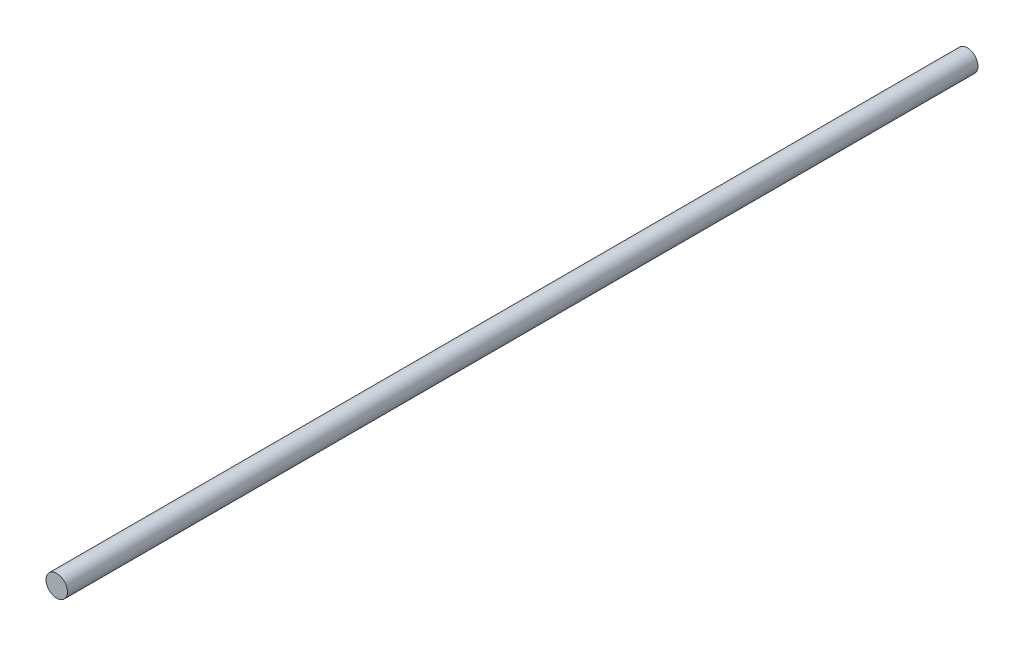
ISO-10303-21;
HEADER;
FILE_DESCRIPTION(('STEP AP214'),'2;1');
FILE_NAME('part.step','',(''),(''),'','','');
FILE_SCHEMA(('AUTOMOTIVE_DESIGN { 1 0 10303 214 1 1 1 1 }'));
ENDSEC;
DATA;
#1=APPLICATION_CONTEXT('core data for automotive mechanical design processes');
#2=APPLICATION_PROTOCOL_DEFINITION('international standard','automotive_design',2000,#1);
#3=PRODUCT_CONTEXT('',#1,'mechanical');
#4=PRODUCT('Part','Part','',(#3));
#5=PRODUCT_RELATED_PRODUCT_CATEGORY('part','',(#4));
#6=PRODUCT_DEFINITION_FORMATION('','',#4);
#7=PRODUCT_DEFINITION_CONTEXT('part definition',#1,'design');
#8=PRODUCT_DEFINITION('design','',#6,#7);
#9=PRODUCT_DEFINITION_SHAPE('','',#8);
#10=(LENGTH_UNIT() NAMED_UNIT(*) SI_UNIT(.MILLI.,.METRE.));
#11=(NAMED_UNIT(*) PLANE_ANGLE_UNIT() SI_UNIT($,.RADIAN.));
#12=(NAMED_UNIT(*) SI_UNIT($,.STERADIAN.) SOLID_ANGLE_UNIT());
#13=UNCERTAINTY_MEASURE_WITH_UNIT(LENGTH_MEASURE(1.E-05),#10,'distance_accuracy_value','');
#14=(GEOMETRIC_REPRESENTATION_CONTEXT(3) GLOBAL_UNCERTAINTY_ASSIGNED_CONTEXT((#13)) GLOBAL_UNIT_ASSIGNED_CONTEXT((#10,
#11,#12)) REPRESENTATION_CONTEXT('',''));
#15=CARTESIAN_POINT('',(0.,0.,0.));
#16=DIRECTION('',(0.,0.,1.));
#17=DIRECTION('',(1.,0.,0.));
#18=AXIS2_PLACEMENT_3D('',#15,#16,#17);
#19=CARTESIAN_POINT('',(0.,0.,269.));
#20=DIRECTION('',(0.,0.,-1.));
#21=DIRECTION('',(-1.,0.,0.));
#22=AXIS2_PLACEMENT_3D('',#19,#20,#21);
#23=CYLINDRICAL_SURFACE('',#22,3.175);
#24=CARTESIAN_POINT('',(0.,0.,269.));
#25=DIRECTION('',(0.,0.,1.));
#26=DIRECTION('',(1.,0.,0.));
#27=AXIS2_PLACEMENT_3D('',#24,#25,#26);
#28=CIRCLE('',#27,3.175);
#29=CARTESIAN_POINT('',(3.175,0.,269.));
#30=VERTEX_POINT('',#29);
#31=EDGE_CURVE('E10',#30,#30,#28,.T.);
#32=ORIENTED_EDGE('',*,*,#31,.F.);
#33=EDGE_LOOP('',(#32));
#34=FACE_BOUND('',#33,.T.);
#35=CARTESIAN_POINT('',(0.,0.,0.));
#36=DIRECTION('',(0.,0.,1.));
#37=DIRECTION('',(1.,0.,0.));
#38=AXIS2_PLACEMENT_3D('',#35,#36,#37);
#39=CIRCLE('',#38,3.175);
#40=CARTESIAN_POINT('',(3.175,0.,0.));
#41=VERTEX_POINT('',#40);
#42=EDGE_CURVE('E40',#41,#41,#39,.T.);
#43=ORIENTED_EDGE('',*,*,#42,.T.);
#44=EDGE_LOOP('',(#43));
#45=FACE_BOUND('',#44,.T.);
#46=ADVANCED_FACE('F37',(#34,#45),#23,.T.);
#47=CARTESIAN_POINT('',(0.,0.,269.));
#48=DIRECTION('',(0.,0.,1.));
#49=DIRECTION('',(1.,0.,0.));
#50=AXIS2_PLACEMENT_3D('',#47,#48,#49);
#51=PLANE('',#50);
#52=ORIENTED_EDGE('',*,*,#31,.T.);
#53=EDGE_LOOP('',(#52));
#54=FACE_BOUND('',#53,.T.);
#55=ADVANCED_FACE('F54',(#54),#51,.T.);
#56=CARTESIAN_POINT('',(0.,0.,0.));
#57=DIRECTION('',(0.,0.,1.));
#58=DIRECTION('',(1.,0.,0.));
#59=AXIS2_PLACEMENT_3D('',#56,#57,#58);
#60=PLANE('',#59);
#61=ORIENTED_EDGE('',*,*,#42,.F.);
#62=EDGE_LOOP('',(#61));
#63=FACE_BOUND('',#62,.T.);
#64=ADVANCED_FACE('F52',(#63),#60,.F.);
#65=CLOSED_SHELL('',(#46,#55,#64));
#66=MANIFOLD_SOLID_BREP('B2',#65);
#67=ADVANCED_BREP_SHAPE_REPRESENTATION('',(#18,#66),#14);
#68=SHAPE_DEFINITION_REPRESENTATION(#9,#67);
ENDSEC;
END-ISO-10303-21;
